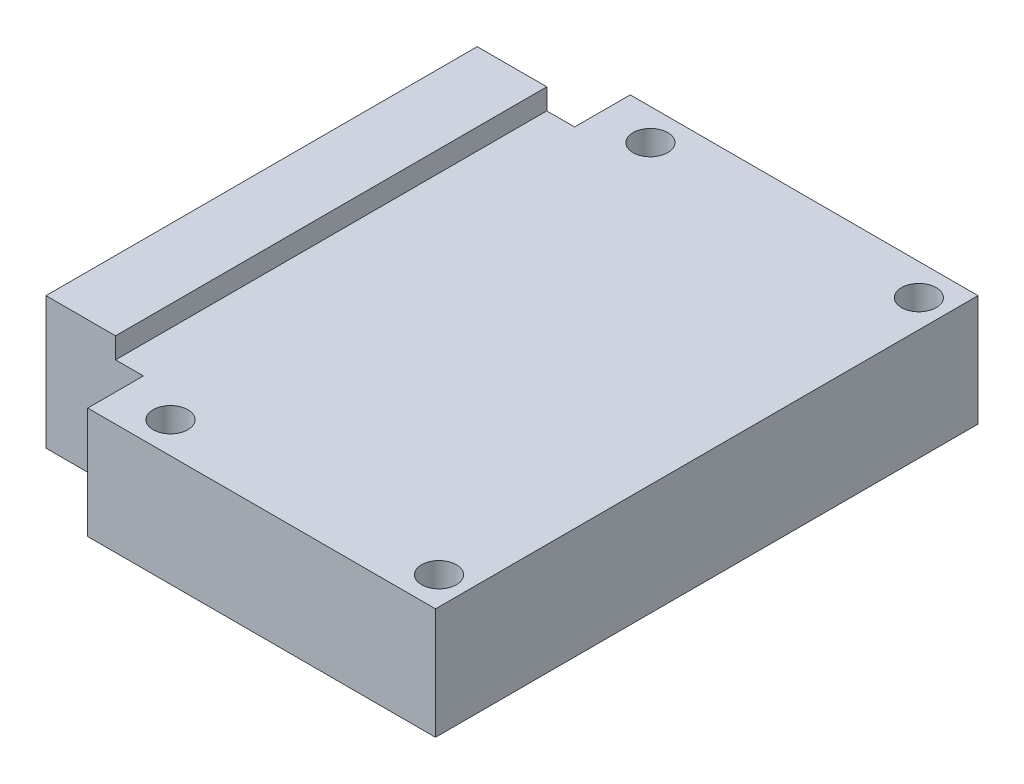
ISO-10303-21;
HEADER;
FILE_DESCRIPTION(('STEP AP214'),'2;1');
FILE_NAME('part.step','',(''),(''),'','','');
FILE_SCHEMA(('AUTOMOTIVE_DESIGN { 1 0 10303 214 1 1 1 1 }'));
ENDSEC;
DATA;
#1=APPLICATION_CONTEXT('core data for automotive mechanical design processes');
#2=APPLICATION_PROTOCOL_DEFINITION('international standard','automotive_design',2000,#1);
#3=PRODUCT_CONTEXT('',#1,'mechanical');
#4=PRODUCT('Part','Part','',(#3));
#5=PRODUCT_RELATED_PRODUCT_CATEGORY('part','',(#4));
#6=PRODUCT_DEFINITION_FORMATION('','',#4);
#7=PRODUCT_DEFINITION_CONTEXT('part definition',#1,'design');
#8=PRODUCT_DEFINITION('design','',#6,#7);
#9=PRODUCT_DEFINITION_SHAPE('','',#8);
#10=(LENGTH_UNIT() NAMED_UNIT(*) SI_UNIT(.MILLI.,.METRE.));
#11=(NAMED_UNIT(*) PLANE_ANGLE_UNIT() SI_UNIT($,.RADIAN.));
#12=(NAMED_UNIT(*) SI_UNIT($,.STERADIAN.) SOLID_ANGLE_UNIT());
#13=UNCERTAINTY_MEASURE_WITH_UNIT(LENGTH_MEASURE(1.E-05),#10,'distance_accuracy_value','');
#14=(GEOMETRIC_REPRESENTATION_CONTEXT(3) GLOBAL_UNCERTAINTY_ASSIGNED_CONTEXT((#13)) GLOBAL_UNIT_ASSIGNED_CONTEXT((#10,
#11,#12)) REPRESENTATION_CONTEXT('',''));
#15=CARTESIAN_POINT('',(0.,0.,0.));
#16=DIRECTION('',(0.,0.,1.));
#17=DIRECTION('',(1.,0.,0.));
#18=AXIS2_PLACEMENT_3D('',#15,#16,#17);
#19=CARTESIAN_POINT('',(0.,16.,31.));
#20=DIRECTION('',(0.,0.,1.));
#21=DIRECTION('',(1.,0.,0.));
#22=AXIS2_PLACEMENT_3D('',#19,#20,#21);
#23=PLANE('',#22);
#24=DIRECTION('',(-1.,0.,0.));
#25=VECTOR('',#24,1.);
#26=CARTESIAN_POINT('',(0.,0.,31.));
#27=LINE('',#26,#25);
#28=CARTESIAN_POINT('',(-18.,0.,31.));
#29=VERTEX_POINT('',#28);
#30=CARTESIAN_POINT('',(-32.,0.,31.));
#31=VERTEX_POINT('',#30);
#32=EDGE_CURVE('E166',#29,#31,#27,.T.);
#33=ORIENTED_EDGE('',*,*,#32,.F.);
#34=DIRECTION('',(0.,-1.,0.));
#35=VECTOR('',#34,1.);
#36=CARTESIAN_POINT('',(-18.,16.,31.));
#37=LINE('',#36,#35);
#38=CARTESIAN_POINT('',(-18.,16.,31.));
#39=VERTEX_POINT('',#38);
#40=EDGE_CURVE('E11',#39,#29,#37,.T.);
#41=ORIENTED_EDGE('',*,*,#40,.F.);
#42=DIRECTION('',(-1.,0.,0.));
#43=VECTOR('',#42,1.);
#44=CARTESIAN_POINT('',(0.,16.,31.));
#45=LINE('',#44,#43);
#46=CARTESIAN_POINT('',(-22.,16.,31.));
#47=VERTEX_POINT('',#46);
#48=EDGE_CURVE('E253',#39,#47,#45,.T.);
#49=ORIENTED_EDGE('',*,*,#48,.T.);
#50=DIRECTION('',(0.,-1.,0.));
#51=VECTOR('',#50,1.);
#52=CARTESIAN_POINT('',(-22.,19.,31.));
#53=LINE('',#52,#51);
#54=CARTESIAN_POINT('',(-22.,19.,31.));
#55=VERTEX_POINT('',#54);
#56=EDGE_CURVE('E230',#55,#47,#53,.T.);
#57=ORIENTED_EDGE('',*,*,#56,.F.);
#58=DIRECTION('',(1.,0.,0.));
#59=VECTOR('',#58,1.);
#60=CARTESIAN_POINT('',(-32.,19.,31.));
#61=LINE('',#60,#59);
#62=CARTESIAN_POINT('',(-32.,19.,31.));
#63=VERTEX_POINT('',#62);
#64=EDGE_CURVE('E232',#63,#55,#61,.T.);
#65=ORIENTED_EDGE('',*,*,#64,.F.);
#66=DIRECTION('',(0.,-1.,0.));
#67=VECTOR('',#66,1.);
#68=CARTESIAN_POINT('',(-32.,16.,31.));
#69=LINE('',#68,#67);
#70=EDGE_CURVE('E99',#63,#31,#69,.T.);
#71=ORIENTED_EDGE('',*,*,#70,.T.);
#72=EDGE_LOOP('',(#33,#41,#49,#57,#65,#71));
#73=FACE_BOUND('',#72,.T.);
#74=ADVANCED_FACE('F41',(#73),#23,.T.);
#75=CARTESIAN_POINT('',(-18.,16.,0.));
#76=DIRECTION('',(-1.,0.,0.));
#77=DIRECTION('',(0.,0.,1.));
#78=AXIS2_PLACEMENT_3D('',#75,#76,#77);
#79=PLANE('',#78);
#80=DIRECTION('',(0.,0.,-1.));
#81=VECTOR('',#80,1.);
#82=CARTESIAN_POINT('',(-18.,0.,0.));
#83=LINE('',#82,#81);
#84=CARTESIAN_POINT('',(-18.,0.,39.));
#85=VERTEX_POINT('',#84);
#86=EDGE_CURVE('E162',#85,#29,#83,.T.);
#87=ORIENTED_EDGE('',*,*,#86,.F.);
#88=DIRECTION('',(0.,-1.,0.));
#89=VECTOR('',#88,1.);
#90=CARTESIAN_POINT('',(-18.,16.,39.));
#91=LINE('',#90,#89);
#92=CARTESIAN_POINT('',(-18.,16.,39.));
#93=VERTEX_POINT('',#92);
#94=EDGE_CURVE('E50',#93,#85,#91,.T.);
#95=ORIENTED_EDGE('',*,*,#94,.F.);
#96=DIRECTION('',(0.,0.,-1.));
#97=VECTOR('',#96,1.);
#98=CARTESIAN_POINT('',(-18.,16.,0.));
#99=LINE('',#98,#97);
#100=EDGE_CURVE('E256',#93,#39,#99,.T.);
#101=ORIENTED_EDGE('',*,*,#100,.T.);
#102=ORIENTED_EDGE('',*,*,#40,.T.);
#103=EDGE_LOOP('',(#87,#95,#101,#102));
#104=FACE_BOUND('',#103,.T.);
#105=ADVANCED_FACE('F163',(#104),#79,.T.);
#106=CARTESIAN_POINT('',(0.,16.,39.));
#107=DIRECTION('',(0.,0.,1.));
#108=DIRECTION('',(1.,0.,0.));
#109=AXIS2_PLACEMENT_3D('',#106,#107,#108);
#110=PLANE('',#109);
#111=DIRECTION('',(-1.,0.,0.));
#112=VECTOR('',#111,1.);
#113=CARTESIAN_POINT('',(0.,0.,39.));
#114=LINE('',#113,#112);
#115=CARTESIAN_POINT('',(32.,0.,39.));
#116=VERTEX_POINT('',#115);
#117=EDGE_CURVE('E158',#116,#85,#114,.T.);
#118=ORIENTED_EDGE('',*,*,#117,.F.);
#119=DIRECTION('',(0.,-1.,0.));
#120=VECTOR('',#119,1.);
#121=CARTESIAN_POINT('',(32.,16.,39.));
#122=LINE('',#121,#120);
#123=CARTESIAN_POINT('',(32.,16.,39.));
#124=VERTEX_POINT('',#123);
#125=EDGE_CURVE('E144',#124,#116,#122,.T.);
#126=ORIENTED_EDGE('',*,*,#125,.F.);
#127=DIRECTION('',(-1.,0.,0.));
#128=VECTOR('',#127,1.);
#129=CARTESIAN_POINT('',(0.,16.,39.));
#130=LINE('',#129,#128);
#131=EDGE_CURVE('E136',#124,#93,#130,.T.);
#132=ORIENTED_EDGE('',*,*,#131,.T.);
#133=ORIENTED_EDGE('',*,*,#94,.T.);
#134=EDGE_LOOP('',(#118,#126,#132,#133));
#135=FACE_BOUND('',#134,.T.);
#136=ADVANCED_FACE('F156',(#135),#110,.T.);
#137=CARTESIAN_POINT('',(32.,16.,0.));
#138=DIRECTION('',(-1.,0.,0.));
#139=DIRECTION('',(0.,0.,1.));
#140=AXIS2_PLACEMENT_3D('',#137,#138,#139);
#141=PLANE('',#140);
#142=DIRECTION('',(0.,0.,-1.));
#143=VECTOR('',#142,1.);
#144=CARTESIAN_POINT('',(32.,0.,0.));
#145=LINE('',#144,#143);
#146=CARTESIAN_POINT('',(32.,0.,-39.));
#147=VERTEX_POINT('',#146);
#148=EDGE_CURVE('E142',#116,#147,#145,.T.);
#149=ORIENTED_EDGE('',*,*,#148,.T.);
#150=DIRECTION('',(0.,-1.,0.));
#151=VECTOR('',#150,1.);
#152=CARTESIAN_POINT('',(32.,16.,-39.));
#153=LINE('',#152,#151);
#154=CARTESIAN_POINT('',(32.,16.,-39.));
#155=VERTEX_POINT('',#154);
#156=EDGE_CURVE('E122',#155,#147,#153,.T.);
#157=ORIENTED_EDGE('',*,*,#156,.F.);
#158=DIRECTION('',(0.,0.,-1.));
#159=VECTOR('',#158,1.);
#160=CARTESIAN_POINT('',(32.,16.,0.));
#161=LINE('',#160,#159);
#162=EDGE_CURVE('E128',#124,#155,#161,.T.);
#163=ORIENTED_EDGE('',*,*,#162,.F.);
#164=ORIENTED_EDGE('',*,*,#125,.T.);
#165=EDGE_LOOP('',(#149,#157,#163,#164));
#166=FACE_BOUND('',#165,.T.);
#167=ADVANCED_FACE('F140',(#166),#141,.F.);
#168=CARTESIAN_POINT('',(0.,16.,-39.));
#169=DIRECTION('',(0.,0.,1.));
#170=DIRECTION('',(1.,0.,0.));
#171=AXIS2_PLACEMENT_3D('',#168,#169,#170);
#172=PLANE('',#171);
#173=DIRECTION('',(-1.,0.,0.));
#174=VECTOR('',#173,1.);
#175=CARTESIAN_POINT('',(0.,0.,-39.));
#176=LINE('',#175,#174);
#177=CARTESIAN_POINT('',(-18.,0.,-39.));
#178=VERTEX_POINT('',#177);
#179=EDGE_CURVE('E173',#147,#178,#176,.T.);
#180=ORIENTED_EDGE('',*,*,#179,.T.);
#181=DIRECTION('',(0.,-1.,0.));
#182=VECTOR('',#181,1.);
#183=CARTESIAN_POINT('',(-18.,16.,-39.));
#184=LINE('',#183,#182);
#185=CARTESIAN_POINT('',(-18.,16.,-39.));
#186=VERTEX_POINT('',#185);
#187=EDGE_CURVE('E125',#186,#178,#184,.T.);
#188=ORIENTED_EDGE('',*,*,#187,.F.);
#189=DIRECTION('',(-1.,0.,0.));
#190=VECTOR('',#189,1.);
#191=CARTESIAN_POINT('',(0.,16.,-39.));
#192=LINE('',#191,#190);
#193=EDGE_CURVE('E117',#155,#186,#192,.T.);
#194=ORIENTED_EDGE('',*,*,#193,.F.);
#195=ORIENTED_EDGE('',*,*,#156,.T.);
#196=EDGE_LOOP('',(#180,#188,#194,#195));
#197=FACE_BOUND('',#196,.T.);
#198=ADVANCED_FACE('F120',(#197),#172,.F.);
#199=CARTESIAN_POINT('',(-18.,16.,0.));
#200=DIRECTION('',(1.,0.,0.));
#201=DIRECTION('',(0.,0.,-1.));
#202=AXIS2_PLACEMENT_3D('',#199,#200,#201);
#203=PLANE('',#202);
#204=DIRECTION('',(0.,0.,1.));
#205=VECTOR('',#204,1.);
#206=CARTESIAN_POINT('',(-18.,0.,0.));
#207=LINE('',#206,#205);
#208=CARTESIAN_POINT('',(-18.,0.,-31.));
#209=VERTEX_POINT('',#208);
#210=EDGE_CURVE('E179',#178,#209,#207,.T.);
#211=ORIENTED_EDGE('',*,*,#210,.T.);
#212=DIRECTION('',(0.,-1.,0.));
#213=VECTOR('',#212,1.);
#214=CARTESIAN_POINT('',(-18.,16.,-31.));
#215=LINE('',#214,#213);
#216=CARTESIAN_POINT('',(-18.,16.,-31.));
#217=VERTEX_POINT('',#216);
#218=EDGE_CURVE('E149',#217,#209,#215,.T.);
#219=ORIENTED_EDGE('',*,*,#218,.F.);
#220=DIRECTION('',(0.,0.,1.));
#221=VECTOR('',#220,1.);
#222=CARTESIAN_POINT('',(-18.,16.,0.));
#223=LINE('',#222,#221);
#224=EDGE_CURVE('E127',#186,#217,#223,.T.);
#225=ORIENTED_EDGE('',*,*,#224,.F.);
#226=ORIENTED_EDGE('',*,*,#187,.T.);
#227=EDGE_LOOP('',(#211,#219,#225,#226));
#228=FACE_BOUND('',#227,.T.);
#229=ADVANCED_FACE('F206',(#228),#203,.F.);
#230=CARTESIAN_POINT('',(0.,16.,-31.));
#231=DIRECTION('',(0.,0.,1.));
#232=DIRECTION('',(1.,0.,0.));
#233=AXIS2_PLACEMENT_3D('',#230,#231,#232);
#234=PLANE('',#233);
#235=DIRECTION('',(-1.,0.,0.));
#236=VECTOR('',#235,1.);
#237=CARTESIAN_POINT('',(0.,0.,-31.));
#238=LINE('',#237,#236);
#239=CARTESIAN_POINT('',(-32.,0.,-31.));
#240=VERTEX_POINT('',#239);
#241=EDGE_CURVE('E183',#209,#240,#238,.T.);
#242=ORIENTED_EDGE('',*,*,#241,.T.);
#243=DIRECTION('',(0.,-1.,0.));
#244=VECTOR('',#243,1.);
#245=CARTESIAN_POINT('',(-32.,16.,-31.));
#246=LINE('',#245,#244);
#247=CARTESIAN_POINT('',(-32.,19.,-31.));
#248=VERTEX_POINT('',#247);
#249=EDGE_CURVE('E198',#248,#240,#246,.T.);
#250=ORIENTED_EDGE('',*,*,#249,.F.);
#251=DIRECTION('',(-1.,0.,0.));
#252=VECTOR('',#251,1.);
#253=CARTESIAN_POINT('',(-32.,19.,-31.));
#254=LINE('',#253,#252);
#255=CARTESIAN_POINT('',(-22.,19.,-31.));
#256=VERTEX_POINT('',#255);
#257=EDGE_CURVE('E217',#256,#248,#254,.T.);
#258=ORIENTED_EDGE('',*,*,#257,.F.);
#259=DIRECTION('',(0.,-1.,0.));
#260=VECTOR('',#259,1.);
#261=CARTESIAN_POINT('',(-22.,19.,-31.));
#262=LINE('',#261,#260);
#263=CARTESIAN_POINT('',(-22.,16.,-31.));
#264=VERTEX_POINT('',#263);
#265=EDGE_CURVE('E226',#256,#264,#262,.T.);
#266=ORIENTED_EDGE('',*,*,#265,.T.);
#267=DIRECTION('',(-1.,0.,0.));
#268=VECTOR('',#267,1.);
#269=CARTESIAN_POINT('',(0.,16.,-31.));
#270=LINE('',#269,#268);
#271=EDGE_CURVE('E65',#217,#264,#270,.T.);
#272=ORIENTED_EDGE('',*,*,#271,.F.);
#273=ORIENTED_EDGE('',*,*,#218,.T.);
#274=EDGE_LOOP('',(#242,#250,#258,#266,#272,#273));
#275=FACE_BOUND('',#274,.T.);
#276=ADVANCED_FACE('F203',(#275),#234,.F.);
#277=CARTESIAN_POINT('',(-32.,16.,0.));
#278=DIRECTION('',(-1.,0.,0.));
#279=DIRECTION('',(0.,0.,1.));
#280=AXIS2_PLACEMENT_3D('',#277,#278,#279);
#281=PLANE('',#280);
#282=DIRECTION('',(0.,0.,-1.));
#283=VECTOR('',#282,1.);
#284=CARTESIAN_POINT('',(-32.,0.,0.));
#285=LINE('',#284,#283);
#286=EDGE_CURVE('E187',#31,#240,#285,.T.);
#287=ORIENTED_EDGE('',*,*,#286,.F.);
#288=ORIENTED_EDGE('',*,*,#70,.F.);
#289=DIRECTION('',(0.,0.,1.));
#290=VECTOR('',#289,1.);
#291=CARTESIAN_POINT('',(-32.,19.,-31.));
#292=LINE('',#291,#290);
#293=EDGE_CURVE('E213',#248,#63,#292,.T.);
#294=ORIENTED_EDGE('',*,*,#293,.F.);
#295=ORIENTED_EDGE('',*,*,#249,.T.);
#296=EDGE_LOOP('',(#287,#288,#294,#295));
#297=FACE_BOUND('',#296,.T.);
#298=ADVANCED_FACE('F209',(#297),#281,.T.);
#299=CARTESIAN_POINT('',(28.,16.,-34.5));
#300=DIRECTION('',(0.,-1.,0.));
#301=DIRECTION('',(0.,0.,-1.));
#302=AXIS2_PLACEMENT_3D('',#299,#300,#301);
#303=CYLINDRICAL_SURFACE('',#302,2.5);
#304=CARTESIAN_POINT('',(28.,16.,-34.5));
#305=DIRECTION('',(0.,1.,0.));
#306=DIRECTION('',(0.,0.,1.));
#307=AXIS2_PLACEMENT_3D('',#304,#305,#306);
#308=CIRCLE('',#307,2.5);
#309=CARTESIAN_POINT('',(28.,16.,-32.));
#310=VERTEX_POINT('',#309);
#311=EDGE_CURVE('E249',#310,#310,#308,.T.);
#312=ORIENTED_EDGE('',*,*,#311,.T.);
#313=EDGE_LOOP('',(#312));
#314=FACE_BOUND('',#313,.T.);
#315=CARTESIAN_POINT('',(28.,0.,-34.5));
#316=DIRECTION('',(0.,1.,0.));
#317=DIRECTION('',(0.,0.,1.));
#318=AXIS2_PLACEMENT_3D('',#315,#316,#317);
#319=CIRCLE('',#318,2.5);
#320=CARTESIAN_POINT('',(28.,0.,-32.));
#321=VERTEX_POINT('',#320);
#322=EDGE_CURVE('E275',#321,#321,#319,.T.);
#323=ORIENTED_EDGE('',*,*,#322,.F.);
#324=EDGE_LOOP('',(#323));
#325=FACE_BOUND('',#324,.T.);
#326=ADVANCED_FACE('F282',(#314,#325),#303,.F.);
#327=CARTESIAN_POINT('',(-10.6,16.,-34.5));
#328=DIRECTION('',(0.,-1.,0.));
#329=DIRECTION('',(0.,0.,-1.));
#330=AXIS2_PLACEMENT_3D('',#327,#328,#329);
#331=CYLINDRICAL_SURFACE('',#330,2.5);
#332=CARTESIAN_POINT('',(-10.6,16.,-34.5));
#333=DIRECTION('',(0.,1.,0.));
#334=DIRECTION('',(0.,0.,1.));
#335=AXIS2_PLACEMENT_3D('',#332,#333,#334);
#336=CIRCLE('',#335,2.5);
#337=CARTESIAN_POINT('',(-10.6,16.,-32.));
#338=VERTEX_POINT('',#337);
#339=EDGE_CURVE('E245',#338,#338,#336,.T.);
#340=ORIENTED_EDGE('',*,*,#339,.T.);
#341=EDGE_LOOP('',(#340));
#342=FACE_BOUND('',#341,.T.);
#343=CARTESIAN_POINT('',(-10.6,0.,-34.5));
#344=DIRECTION('',(0.,1.,0.));
#345=DIRECTION('',(0.,0.,1.));
#346=AXIS2_PLACEMENT_3D('',#343,#344,#345);
#347=CIRCLE('',#346,2.5);
#348=CARTESIAN_POINT('',(-10.6,0.,-32.));
#349=VERTEX_POINT('',#348);
#350=EDGE_CURVE('E271',#349,#349,#347,.T.);
#351=ORIENTED_EDGE('',*,*,#350,.F.);
#352=EDGE_LOOP('',(#351));
#353=FACE_BOUND('',#352,.T.);
#354=ADVANCED_FACE('F284',(#342,#353),#331,.F.);
#355=CARTESIAN_POINT('',(28.,16.,34.5));
#356=DIRECTION('',(0.,-1.,0.));
#357=DIRECTION('',(0.,0.,-1.));
#358=AXIS2_PLACEMENT_3D('',#355,#356,#357);
#359=CYLINDRICAL_SURFACE('',#358,2.5);
#360=CARTESIAN_POINT('',(28.,16.,34.5));
#361=DIRECTION('',(0.,1.,0.));
#362=DIRECTION('',(0.,0.,1.));
#363=AXIS2_PLACEMENT_3D('',#360,#361,#362);
#364=CIRCLE('',#363,2.5);
#365=CARTESIAN_POINT('',(28.,16.,37.));
#366=VERTEX_POINT('',#365);
#367=EDGE_CURVE('E195',#366,#366,#364,.F.);
#368=ORIENTED_EDGE('',*,*,#367,.F.);
#369=EDGE_LOOP('',(#368));
#370=FACE_BOUND('',#369,.T.);
#371=CARTESIAN_POINT('',(28.,0.,34.5));
#372=DIRECTION('',(0.,1.,0.));
#373=DIRECTION('',(0.,0.,1.));
#374=AXIS2_PLACEMENT_3D('',#371,#372,#373);
#375=CIRCLE('',#374,2.5);
#376=CARTESIAN_POINT('',(28.,0.,37.));
#377=VERTEX_POINT('',#376);
#378=EDGE_CURVE('E241',#377,#377,#375,.F.);
#379=ORIENTED_EDGE('',*,*,#378,.T.);
#380=EDGE_LOOP('',(#379));
#381=FACE_BOUND('',#380,.T.);
#382=ADVANCED_FACE('F43',(#370,#381),#359,.F.);
#383=CARTESIAN_POINT('',(-10.6,16.,34.5));
#384=DIRECTION('',(0.,-1.,0.));
#385=DIRECTION('',(0.,0.,-1.));
#386=AXIS2_PLACEMENT_3D('',#383,#384,#385);
#387=CYLINDRICAL_SURFACE('',#386,2.5);
#388=CARTESIAN_POINT('',(-10.6,16.,34.5));
#389=DIRECTION('',(0.,1.,0.));
#390=DIRECTION('',(0.,0.,1.));
#391=AXIS2_PLACEMENT_3D('',#388,#389,#390);
#392=CIRCLE('',#391,2.5);
#393=CARTESIAN_POINT('',(-10.6,16.,37.));
#394=VERTEX_POINT('',#393);
#395=EDGE_CURVE('E199',#394,#394,#392,.F.);
#396=ORIENTED_EDGE('',*,*,#395,.F.);
#397=EDGE_LOOP('',(#396));
#398=FACE_BOUND('',#397,.T.);
#399=CARTESIAN_POINT('',(-10.6,0.,34.5));
#400=DIRECTION('',(0.,1.,0.));
#401=DIRECTION('',(0.,0.,1.));
#402=AXIS2_PLACEMENT_3D('',#399,#400,#401);
#403=CIRCLE('',#402,2.5);
#404=CARTESIAN_POINT('',(-10.6,0.,37.));
#405=VERTEX_POINT('',#404);
#406=EDGE_CURVE('E191',#405,#405,#403,.F.);
#407=ORIENTED_EDGE('',*,*,#406,.T.);
#408=EDGE_LOOP('',(#407));
#409=FACE_BOUND('',#408,.T.);
#410=ADVANCED_FACE('F310',(#398,#409),#387,.F.);
#411=CARTESIAN_POINT('',(0.,16.,0.));
#412=DIRECTION('',(0.,1.,0.));
#413=DIRECTION('',(0.,0.,1.));
#414=AXIS2_PLACEMENT_3D('',#411,#412,#413);
#415=PLANE('',#414);
#416=DIRECTION('',(0.,0.,-1.));
#417=VECTOR('',#416,1.);
#418=CARTESIAN_POINT('',(-22.,16.,-31.));
#419=LINE('',#418,#417);
#420=EDGE_CURVE('E57',#47,#264,#419,.T.);
#421=ORIENTED_EDGE('',*,*,#420,.F.);
#422=ORIENTED_EDGE('',*,*,#48,.F.);
#423=ORIENTED_EDGE('',*,*,#100,.F.);
#424=ORIENTED_EDGE('',*,*,#131,.F.);
#425=ORIENTED_EDGE('',*,*,#162,.T.);
#426=ORIENTED_EDGE('',*,*,#193,.T.);
#427=ORIENTED_EDGE('',*,*,#224,.T.);
#428=ORIENTED_EDGE('',*,*,#271,.T.);
#429=EDGE_LOOP('',(#421,#422,#423,#424,#425,#426,#427,#428));
#430=FACE_BOUND('',#429,.T.);
#431=ORIENTED_EDGE('',*,*,#367,.T.);
#432=EDGE_LOOP('',(#431));
#433=FACE_BOUND('',#432,.T.);
#434=ORIENTED_EDGE('',*,*,#339,.F.);
#435=EDGE_LOOP('',(#434));
#436=FACE_BOUND('',#435,.T.);
#437=ORIENTED_EDGE('',*,*,#311,.F.);
#438=EDGE_LOOP('',(#437));
#439=FACE_BOUND('',#438,.T.);
#440=ORIENTED_EDGE('',*,*,#395,.T.);
#441=EDGE_LOOP('',(#440));
#442=FACE_BOUND('',#441,.T.);
#443=ADVANCED_FACE('F132',(#430,#433,#436,#439,#442),#415,.T.);
#444=CARTESIAN_POINT('',(0.,0.,0.));
#445=DIRECTION('',(0.,1.,0.));
#446=DIRECTION('',(0.,0.,1.));
#447=AXIS2_PLACEMENT_3D('',#444,#445,#446);
#448=PLANE('',#447);
#449=ORIENTED_EDGE('',*,*,#378,.F.);
#450=EDGE_LOOP('',(#449));
#451=FACE_BOUND('',#450,.T.);
#452=ORIENTED_EDGE('',*,*,#350,.T.);
#453=EDGE_LOOP('',(#452));
#454=FACE_BOUND('',#453,.T.);
#455=ORIENTED_EDGE('',*,*,#322,.T.);
#456=EDGE_LOOP('',(#455));
#457=FACE_BOUND('',#456,.T.);
#458=ORIENTED_EDGE('',*,*,#32,.T.);
#459=ORIENTED_EDGE('',*,*,#286,.T.);
#460=ORIENTED_EDGE('',*,*,#241,.F.);
#461=ORIENTED_EDGE('',*,*,#210,.F.);
#462=ORIENTED_EDGE('',*,*,#179,.F.);
#463=ORIENTED_EDGE('',*,*,#148,.F.);
#464=ORIENTED_EDGE('',*,*,#117,.T.);
#465=ORIENTED_EDGE('',*,*,#86,.T.);
#466=EDGE_LOOP('',(#458,#459,#460,#461,#462,#463,#464,#465));
#467=FACE_BOUND('',#466,.T.);
#468=ORIENTED_EDGE('',*,*,#406,.F.);
#469=EDGE_LOOP('',(#468));
#470=FACE_BOUND('',#469,.T.);
#471=ADVANCED_FACE('F168',(#451,#454,#457,#467,#470),#448,.F.);
#472=CARTESIAN_POINT('',(-22.,19.,-31.));
#473=DIRECTION('',(-1.,0.,0.));
#474=DIRECTION('',(0.,0.,1.));
#475=AXIS2_PLACEMENT_3D('',#472,#473,#474);
#476=PLANE('',#475);
#477=ORIENTED_EDGE('',*,*,#420,.T.);
#478=ORIENTED_EDGE('',*,*,#265,.F.);
#479=DIRECTION('',(0.,0.,-1.));
#480=VECTOR('',#479,1.);
#481=CARTESIAN_POINT('',(-22.,19.,-31.));
#482=LINE('',#481,#480);
#483=EDGE_CURVE('E223',#55,#256,#482,.T.);
#484=ORIENTED_EDGE('',*,*,#483,.F.);
#485=ORIENTED_EDGE('',*,*,#56,.T.);
#486=EDGE_LOOP('',(#477,#478,#484,#485));
#487=FACE_BOUND('',#486,.T.);
#488=ADVANCED_FACE('F316',(#487),#476,.F.);
#489=CARTESIAN_POINT('',(0.,19.,0.));
#490=DIRECTION('',(0.,1.,0.));
#491=DIRECTION('',(0.,0.,1.));
#492=AXIS2_PLACEMENT_3D('',#489,#490,#491);
#493=PLANE('',#492);
#494=ORIENTED_EDGE('',*,*,#293,.T.);
#495=ORIENTED_EDGE('',*,*,#64,.T.);
#496=ORIENTED_EDGE('',*,*,#483,.T.);
#497=ORIENTED_EDGE('',*,*,#257,.T.);
#498=EDGE_LOOP('',(#494,#495,#496,#497));
#499=FACE_BOUND('',#498,.T.);
#500=ADVANCED_FACE('F220',(#499),#493,.T.);
#501=CLOSED_SHELL('',(#74,#105,#136,#167,#198,#229,#276,#298,#326,#354,#382,#410,#443,#471,#488,#500));
#502=MANIFOLD_SOLID_BREP('B2',#501);
#503=ADVANCED_BREP_SHAPE_REPRESENTATION('',(#18,#502),#14);
#504=SHAPE_DEFINITION_REPRESENTATION(#9,#503);
ENDSEC;
END-ISO-10303-21;
